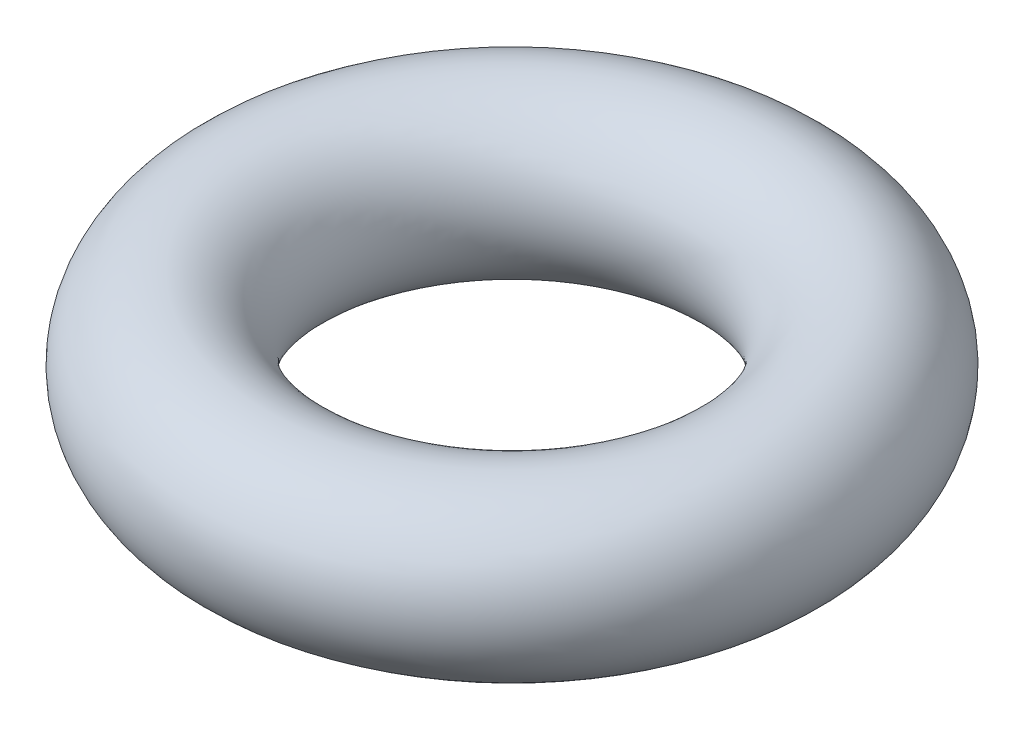
ISO-10303-21;
HEADER;
FILE_DESCRIPTION(('STEP AP214'),'2;1');
FILE_NAME('part.step','',(''),(''),'','','');
FILE_SCHEMA(('AUTOMOTIVE_DESIGN { 1 0 10303 214 1 1 1 1 }'));
ENDSEC;
DATA;
#1=APPLICATION_CONTEXT('core data for automotive mechanical design processes');
#2=APPLICATION_PROTOCOL_DEFINITION('international standard','automotive_design',2000,#1);
#3=PRODUCT_CONTEXT('',#1,'mechanical');
#4=PRODUCT('Part','Part','',(#3));
#5=PRODUCT_RELATED_PRODUCT_CATEGORY('part','',(#4));
#6=PRODUCT_DEFINITION_FORMATION('','',#4);
#7=PRODUCT_DEFINITION_CONTEXT('part definition',#1,'design');
#8=PRODUCT_DEFINITION('design','',#6,#7);
#9=PRODUCT_DEFINITION_SHAPE('','',#8);
#10=(LENGTH_UNIT() NAMED_UNIT(*) SI_UNIT(.MILLI.,.METRE.));
#11=(NAMED_UNIT(*) PLANE_ANGLE_UNIT() SI_UNIT($,.RADIAN.));
#12=(NAMED_UNIT(*) SI_UNIT($,.STERADIAN.) SOLID_ANGLE_UNIT());
#13=UNCERTAINTY_MEASURE_WITH_UNIT(LENGTH_MEASURE(1.E-05),#10,'distance_accuracy_value','');
#14=(GEOMETRIC_REPRESENTATION_CONTEXT(3) GLOBAL_UNCERTAINTY_ASSIGNED_CONTEXT((#13)) GLOBAL_UNIT_ASSIGNED_CONTEXT((#10,
#11,#12)) REPRESENTATION_CONTEXT('',''));
#15=CARTESIAN_POINT('',(0.,0.,0.));
#16=DIRECTION('',(0.,0.,1.));
#17=DIRECTION('',(1.,0.,0.));
#18=AXIS2_PLACEMENT_3D('',#15,#16,#17);
#19=CARTESIAN_POINT('',(0.,0.,0.));
#20=DIRECTION('',(0.,-1.,0.));
#21=DIRECTION('',(0.,0.,-1.));
#22=AXIS2_PLACEMENT_3D('',#19,#20,#21);
#23=TOROIDAL_SURFACE('',#22,2.3876,0.79375);
#24=CARTESIAN_POINT('',(0.,0.,-3.18135));
#25=VERTEX_POINT('',#24);
#26=VERTEX_LOOP('',#25);
#27=FACE_BOUND('',#26,.T.);
#28=ADVANCED_FACE('F28',(#27),#23,.T.);
#29=CLOSED_SHELL('',(#28));
#30=MANIFOLD_SOLID_BREP('B2',#29);
#31=ADVANCED_BREP_SHAPE_REPRESENTATION('',(#18,#30),#14);
#32=SHAPE_DEFINITION_REPRESENTATION(#9,#31);
ENDSEC;
END-ISO-10303-21;
